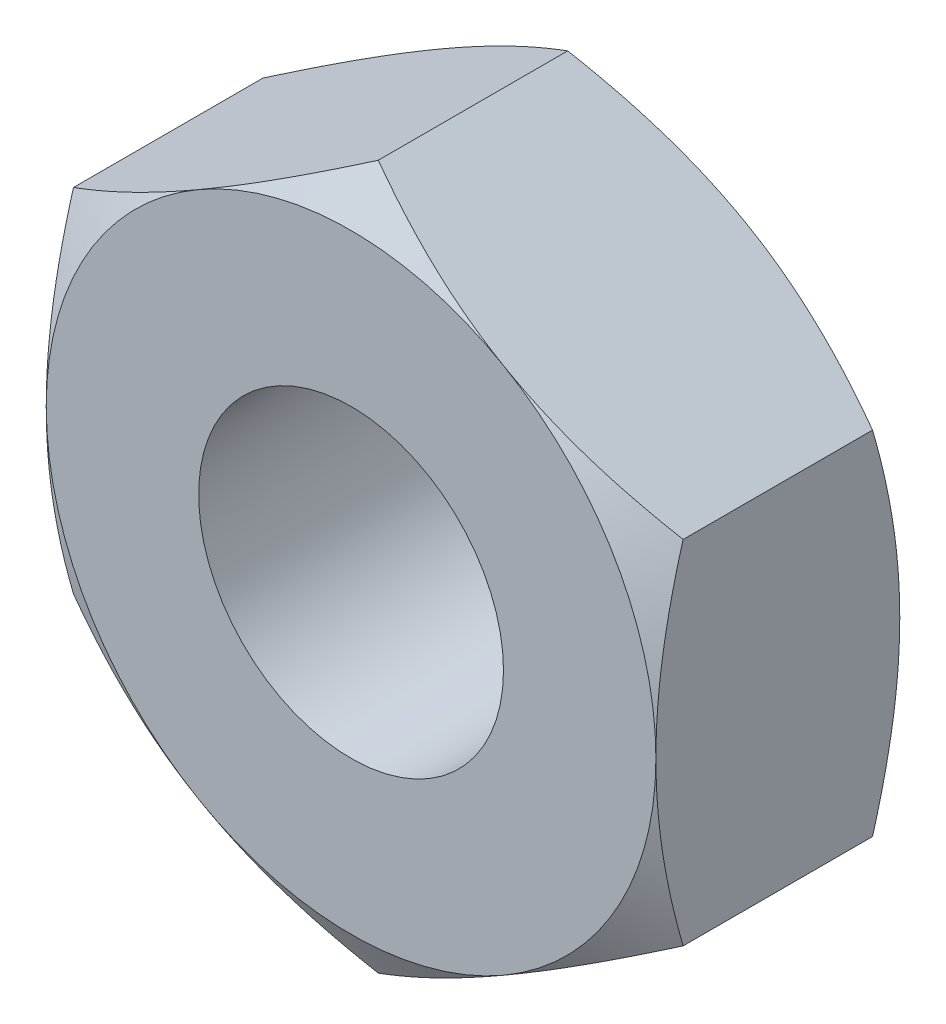
ISO-10303-21;
HEADER;
FILE_DESCRIPTION(('STEP AP214'),'2;1');
FILE_NAME('part.step','',(''),(''),'','','');
FILE_SCHEMA(('AUTOMOTIVE_DESIGN { 1 0 10303 214 1 1 1 1 }'));
ENDSEC;
DATA;
#1=APPLICATION_CONTEXT('core data for automotive mechanical design processes');
#2=APPLICATION_PROTOCOL_DEFINITION('international standard','automotive_design',2000,#1);
#3=PRODUCT_CONTEXT('',#1,'mechanical');
#4=PRODUCT('Part','Part','',(#3));
#5=PRODUCT_RELATED_PRODUCT_CATEGORY('part','',(#4));
#6=PRODUCT_DEFINITION_FORMATION('','',#4);
#7=PRODUCT_DEFINITION_CONTEXT('part definition',#1,'design');
#8=PRODUCT_DEFINITION('design','',#6,#7);
#9=PRODUCT_DEFINITION_SHAPE('','',#8);
#10=(LENGTH_UNIT() NAMED_UNIT(*) SI_UNIT(.MILLI.,.METRE.));
#11=(NAMED_UNIT(*) PLANE_ANGLE_UNIT() SI_UNIT($,.RADIAN.));
#12=(NAMED_UNIT(*) SI_UNIT($,.STERADIAN.) SOLID_ANGLE_UNIT());
#13=UNCERTAINTY_MEASURE_WITH_UNIT(LENGTH_MEASURE(1.E-05),#10,'distance_accuracy_value','');
#14=(GEOMETRIC_REPRESENTATION_CONTEXT(3) GLOBAL_UNCERTAINTY_ASSIGNED_CONTEXT((#13)) GLOBAL_UNIT_ASSIGNED_CONTEXT((#10,
#11,#12)) REPRESENTATION_CONTEXT('',''));
#15=CARTESIAN_POINT('',(0.,0.,0.));
#16=DIRECTION('',(0.,0.,1.));
#17=DIRECTION('',(1.,0.,0.));
#18=AXIS2_PLACEMENT_3D('',#15,#16,#17);
#19=CARTESIAN_POINT('',(0.,0.,-1.));
#20=DIRECTION('',(0.,0.,1.));
#21=DIRECTION('',(1.,0.,0.));
#22=AXIS2_PLACEMENT_3D('',#19,#20,#21);
#23=PLANE('',#22);
#24=CARTESIAN_POINT('',(0.,0.,-1.));
#25=DIRECTION('',(0.,0.,1.));
#26=DIRECTION('',(1.,0.,0.));
#27=AXIS2_PLACEMENT_3D('',#24,#25,#26);
#28=CIRCLE('',#27,1.25);
#29=CARTESIAN_POINT('',(1.25,0.,-1.));
#30=VERTEX_POINT('',#29);
#31=EDGE_CURVE('E256',#30,#30,#28,.T.);
#32=ORIENTED_EDGE('',*,*,#31,.T.);
#33=EDGE_LOOP('',(#32));
#34=FACE_BOUND('',#33,.T.);
#35=CARTESIAN_POINT('',(0.,0.,-1.));
#36=DIRECTION('',(0.,0.,1.));
#37=DIRECTION('',(1.,0.,0.));
#38=AXIS2_PLACEMENT_3D('',#35,#36,#37);
#39=CIRCLE('',#38,2.50000000000001);
#40=CARTESIAN_POINT('',(2.50000000000001,0.,-1.));
#41=VERTEX_POINT('',#40);
#42=CARTESIAN_POINT('',(1.25,2.1650635094611,-1.));
#43=VERTEX_POINT('',#42);
#44=EDGE_CURVE('E144',#41,#43,#39,.T.);
#45=ORIENTED_EDGE('',*,*,#44,.F.);
#46=CARTESIAN_POINT('',(0.,0.,-1.));
#47=DIRECTION('',(0.,0.,1.));
#48=DIRECTION('',(1.,0.,0.));
#49=AXIS2_PLACEMENT_3D('',#46,#47,#48);
#50=CIRCLE('',#49,2.50000000000001);
#51=CARTESIAN_POINT('',(1.25,-2.1650635094611,-1.));
#52=VERTEX_POINT('',#51);
#53=EDGE_CURVE('E12',#41,#52,#50,.F.);
#54=ORIENTED_EDGE('',*,*,#53,.T.);
#55=CARTESIAN_POINT('',(-1.25,-2.1650635094611,-1.));
#56=VERTEX_POINT('',#55);
#57=EDGE_CURVE('E52',#52,#56,#50,.F.);
#58=ORIENTED_EDGE('',*,*,#57,.T.);
#59=CARTESIAN_POINT('',(-2.50000000000001,0.,-1.));
#60=VERTEX_POINT('',#59);
#61=EDGE_CURVE('E507',#56,#60,#50,.F.);
#62=ORIENTED_EDGE('',*,*,#61,.T.);
#63=CARTESIAN_POINT('',(-1.25,2.1650635094611,-1.));
#64=VERTEX_POINT('',#63);
#65=EDGE_CURVE('E152',#60,#64,#50,.F.);
#66=ORIENTED_EDGE('',*,*,#65,.T.);
#67=EDGE_CURVE('E53',#64,#43,#50,.F.);
#68=ORIENTED_EDGE('',*,*,#67,.T.);
#69=EDGE_LOOP('',(#45,#54,#58,#62,#66,#68));
#70=FACE_BOUND('',#69,.T.);
#71=ADVANCED_FACE('F43',(#34,#70),#23,.F.);
#72=CARTESIAN_POINT('',(0.,0.,1.));
#73=DIRECTION('',(0.,0.,1.));
#74=DIRECTION('',(1.,0.,0.));
#75=AXIS2_PLACEMENT_3D('',#72,#73,#74);
#76=PLANE('',#75);
#77=CARTESIAN_POINT('',(0.,0.,1.));
#78=DIRECTION('',(0.,0.,1.));
#79=DIRECTION('',(1.,0.,0.));
#80=AXIS2_PLACEMENT_3D('',#77,#78,#79);
#81=CIRCLE('',#80,1.25);
#82=CARTESIAN_POINT('',(1.25,0.,1.));
#83=VERTEX_POINT('',#82);
#84=EDGE_CURVE('E259',#83,#83,#81,.T.);
#85=ORIENTED_EDGE('',*,*,#84,.F.);
#86=EDGE_LOOP('',(#85));
#87=FACE_BOUND('',#86,.T.);
#88=CARTESIAN_POINT('',(0.,0.,1.));
#89=DIRECTION('',(0.,0.,1.));
#90=DIRECTION('',(1.,0.,0.));
#91=AXIS2_PLACEMENT_3D('',#88,#89,#90);
#92=CIRCLE('',#91,2.50000000000001);
#93=CARTESIAN_POINT('',(1.25,-2.16506350946109,1.));
#94=VERTEX_POINT('',#93);
#95=CARTESIAN_POINT('',(2.49999999999999,0.,1.));
#96=VERTEX_POINT('',#95);
#97=EDGE_CURVE('E158',#94,#96,#92,.T.);
#98=ORIENTED_EDGE('',*,*,#97,.T.);
#99=CARTESIAN_POINT('',(1.25,2.1650635094611,1.));
#100=VERTEX_POINT('',#99);
#101=EDGE_CURVE('E162',#96,#100,#92,.T.);
#102=ORIENTED_EDGE('',*,*,#101,.T.);
#103=CARTESIAN_POINT('',(-1.25,2.1650635094611,1.));
#104=VERTEX_POINT('',#103);
#105=EDGE_CURVE('E307',#100,#104,#92,.T.);
#106=ORIENTED_EDGE('',*,*,#105,.T.);
#107=CARTESIAN_POINT('',(-2.5,0.,1.));
#108=VERTEX_POINT('',#107);
#109=EDGE_CURVE('E311',#104,#108,#92,.T.);
#110=ORIENTED_EDGE('',*,*,#109,.T.);
#111=CARTESIAN_POINT('',(-1.25,-2.16506350946109,1.));
#112=VERTEX_POINT('',#111);
#113=EDGE_CURVE('E313',#108,#112,#92,.T.);
#114=ORIENTED_EDGE('',*,*,#113,.T.);
#115=EDGE_CURVE('E160',#112,#94,#92,.T.);
#116=ORIENTED_EDGE('',*,*,#115,.T.);
#117=EDGE_LOOP('',(#98,#102,#106,#110,#114,#116));
#118=FACE_BOUND('',#117,.T.);
#119=ADVANCED_FACE('F288',(#87,#118),#76,.T.);
#120=CARTESIAN_POINT('',(2.49999999999999,1.44337567297407,1.));
#121=DIRECTION('',(-0.499999999999999,-0.866025403784439,0.));
#122=DIRECTION('',(0.866025403784439,-0.499999999999999,0.));
#123=AXIS2_PLACEMENT_3D('',#120,#121,#122);
#124=PLANE('',#123);
#125=DIRECTION('',(0.,0.,-1.));
#126=VECTOR('',#125,1.);
#127=CARTESIAN_POINT('',(2.49999999999999,1.44337567297407,1.));
#128=LINE('',#127,#126);
#129=CARTESIAN_POINT('',(2.49999999999999,1.44337567297407,0.776709006307406));
#130=VERTEX_POINT('',#129);
#131=CARTESIAN_POINT('',(2.49999999999999,1.44337567297407,-0.776709006307406));
#132=VERTEX_POINT('',#131);
#133=EDGE_CURVE('E157',#130,#132,#128,.T.);
#134=ORIENTED_EDGE('',*,*,#133,.T.);
#135=CARTESIAN_POINT('',(2.50019999999999,1.44326020292023,-0.776642335640899));
#136=CARTESIAN_POINT('',(2.39033676526512,1.50668977106846,-0.813278379892381));
#137=CARTESIAN_POINT('',(2.27952520010347,1.57066685804386,-0.84659778103495));
#138=CARTESIAN_POINT('',(2.05598316653394,1.69972891130042,-0.904757714442148));
#139=CARTESIAN_POINT('',(1.9432487254716,1.7648161711947,-0.929577670852267));
#140=CARTESIAN_POINT('',(1.71917700612472,1.89418403867741,-0.968214348558953));
#141=CARTESIAN_POINT('',(1.60787420823261,1.95844473900197,-0.982288203814366));
#142=CARTESIAN_POINT('',(1.38474477253166,2.08726857876805,-0.999090847647254));
#143=CARTESIAN_POINT('',(1.27291894598576,2.15183124982667,-1.00183354879638));
#144=CARTESIAN_POINT('',(1.06395802444847,2.27247489412634,-0.99613423999195));
#145=CARTESIAN_POINT('',(0.966791682442262,2.3285739078398,-0.989091605618142));
#146=CARTESIAN_POINT('',(0.773092050288991,2.44040644260542,-0.966768580875061));
#147=CARTESIAN_POINT('',(0.676559430340262,2.4961395767184,-0.951480561559736));
#148=CARTESIAN_POINT('',(0.482460278259519,2.60820277442169,-0.913260906155583));
#149=CARTESIAN_POINT('',(0.384918318217855,2.66451865130903,-0.890167223874487));
#150=CARTESIAN_POINT('',(0.191289391923911,2.77631036402774,-0.837753343422091));
#151=CARTESIAN_POINT('',(0.0951999441138209,2.83178763258718,-0.808445464375456));
#152=CARTESIAN_POINT('',(-0.000200000000002555,2.88686681600197,-0.776642335640896));
#153=B_SPLINE_CURVE_WITH_KNOTS('',3,(#135,#136,#137,#138,#139,#140,#141,#142,#143,#144,#145,
#146,#147,#148,#149,#150,#151,#152),.UNSPECIFIED.,.F.,.F.,(4,2,2,2,2,2,2,2,4),(0.,
0.396285827362226,0.793524330152049,1.18093086852114,1.56786160134475,1.90479741793733,
2.24204551660462,2.58677531536755,2.93082800105255),.UNSPECIFIED.);
#154=EDGE_CURVE('E65',#132,#43,#153,.T.);
#155=ORIENTED_EDGE('',*,*,#154,.T.);
#156=CARTESIAN_POINT('',(0.,2.88675134594813,-0.776709006307403));
#157=VERTEX_POINT('',#156);
#158=EDGE_CURVE('E133',#43,#157,#153,.T.);
#159=ORIENTED_EDGE('',*,*,#158,.T.);
#160=DIRECTION('',(0.,0.,-1.));
#161=VECTOR('',#160,1.);
#162=CARTESIAN_POINT('',(0.,2.88675134594813,1.));
#163=LINE('',#162,#161);
#164=CARTESIAN_POINT('',(0.,2.88675134594813,0.776709006307403));
#165=VERTEX_POINT('',#164);
#166=EDGE_CURVE('E275',#165,#157,#163,.T.);
#167=ORIENTED_EDGE('',*,*,#166,.F.);
#168=CARTESIAN_POINT('',(2.50019999999999,1.44326020292023,0.776642335640899));
#169=CARTESIAN_POINT('',(2.39033676526512,1.50668977106846,0.813278379892381));
#170=CARTESIAN_POINT('',(2.27952520010347,1.57066685804386,0.84659778103495));
#171=CARTESIAN_POINT('',(2.05598316653394,1.69972891130042,0.904757714442148));
#172=CARTESIAN_POINT('',(1.9432487254716,1.7648161711947,0.929577670852267));
#173=CARTESIAN_POINT('',(1.71917700612472,1.89418403867741,0.968214348558953));
#174=CARTESIAN_POINT('',(1.60787420823261,1.95844473900197,0.982288203814366));
#175=CARTESIAN_POINT('',(1.38474477253166,2.08726857876805,0.999090847647254));
#176=CARTESIAN_POINT('',(1.27291894598576,2.15183124982667,1.00183354879638));
#177=CARTESIAN_POINT('',(1.06395802444847,2.27247489412634,0.99613423999195));
#178=CARTESIAN_POINT('',(0.966791682442262,2.3285739078398,0.989091605618142));
#179=CARTESIAN_POINT('',(0.773092050288991,2.44040644260542,0.966768580875061));
#180=CARTESIAN_POINT('',(0.676559430340262,2.4961395767184,0.951480561559736));
#181=CARTESIAN_POINT('',(0.482460278259519,2.60820277442169,0.913260906155583));
#182=CARTESIAN_POINT('',(0.384918318217855,2.66451865130903,0.890167223874487));
#183=CARTESIAN_POINT('',(0.191289391923911,2.77631036402774,0.837753343422091));
#184=CARTESIAN_POINT('',(0.0951999441138209,2.83178763258718,0.808445464375456));
#185=CARTESIAN_POINT('',(-0.000200000000002555,2.88686681600197,0.776642335640896));
#186=B_SPLINE_CURVE_WITH_KNOTS('',3,(#168,#169,#170,#171,#172,#173,#174,#175,#176,#177,#178,
#179,#180,#181,#182,#183,#184,#185),.UNSPECIFIED.,.F.,.F.,(4,2,2,2,2,2,2,2,4),(0.,
0.396285827362226,0.793524330152049,1.18093086852114,1.56786160134475,1.90479741793733,
2.24204551660462,2.58677531536755,2.93082800105255),.UNSPECIFIED.);
#187=EDGE_CURVE('E249',#100,#165,#186,.T.);
#188=ORIENTED_EDGE('',*,*,#187,.F.);
#189=EDGE_CURVE('E255',#130,#100,#186,.T.);
#190=ORIENTED_EDGE('',*,*,#189,.F.);
#191=EDGE_LOOP('',(#134,#155,#159,#167,#188,#190));
#192=FACE_BOUND('',#191,.T.);
#193=ADVANCED_FACE('F45',(#192),#124,.F.);
#194=CARTESIAN_POINT('',(0.,2.88675134594813,1.));
#195=DIRECTION('',(0.5,-0.866025403784439,0.));
#196=DIRECTION('',(0.866025403784439,0.5,0.));
#197=AXIS2_PLACEMENT_3D('',#194,#195,#196);
#198=PLANE('',#197);
#199=ORIENTED_EDGE('',*,*,#166,.T.);
#200=CARTESIAN_POINT('',(0.000199999999997349,2.88686681600197,-0.776642335640896));
#201=CARTESIAN_POINT('',(-0.109663234734874,2.82343724785375,-0.813278379892378));
#202=CARTESIAN_POINT('',(-0.220474799896528,2.75946016087834,-0.846597781034948));
#203=CARTESIAN_POINT('',(-0.444016833466052,2.63039810762178,-0.904757714442146));
#204=CARTESIAN_POINT('',(-0.556751274528391,2.5653108477275,-0.929577670852265));
#205=CARTESIAN_POINT('',(-0.780822993875272,2.43594298024479,-0.968214348558951));
#206=CARTESIAN_POINT('',(-0.89212579176738,2.37168227992023,-0.982288203814364));
#207=CARTESIAN_POINT('',(-1.11525522746834,2.24285844015415,-0.999090847647253));
#208=CARTESIAN_POINT('',(-1.22708105401423,2.17829576909553,-1.00183354879638));
#209=CARTESIAN_POINT('',(-1.43604197555152,2.05765212479586,-0.996134239991949));
#210=CARTESIAN_POINT('',(-1.53320831755773,2.0015531110824,-0.989091605618141));
#211=CARTESIAN_POINT('',(-1.72690794971101,1.88972057631678,-0.96676858087506));
#212=CARTESIAN_POINT('',(-1.82344056965974,1.8339874422038,-0.951480561559735));
#213=CARTESIAN_POINT('',(-2.01753972174048,1.7219242445005,-0.913260906155582));
#214=CARTESIAN_POINT('',(-2.11508168178214,1.66560836761317,-0.890167223874485));
#215=CARTESIAN_POINT('',(-2.30871060807609,1.55381665489446,-0.83775334342209));
#216=CARTESIAN_POINT('',(-2.40480005588618,1.49833938633502,-0.808445464375454));
#217=CARTESIAN_POINT('',(-2.5002,1.44326020292023,-0.776642335640894));
#218=B_SPLINE_CURVE_WITH_KNOTS('',3,(#200,#201,#202,#203,#204,#205,#206,#207,#208,#209,#210,
#211,#212,#213,#214,#215,#216,#217),.UNSPECIFIED.,.F.,.F.,(4,2,2,2,2,2,2,2,4),(0.,
0.396285827362226,0.793524330152051,1.18093086852114,1.56786160134475,1.90479741793733,
2.24204551660463,2.58677531536756,2.93082800105256),.UNSPECIFIED.);
#219=EDGE_CURVE('E138',#157,#64,#218,.T.);
#220=ORIENTED_EDGE('',*,*,#219,.T.);
#221=CARTESIAN_POINT('',(-2.5,1.44337567297407,-0.776709006307401));
#222=VERTEX_POINT('',#221);
#223=EDGE_CURVE('E169',#64,#222,#218,.T.);
#224=ORIENTED_EDGE('',*,*,#223,.T.);
#225=DIRECTION('',(0.,0.,-1.));
#226=VECTOR('',#225,1.);
#227=CARTESIAN_POINT('',(-2.5,1.44337567297407,1.));
#228=LINE('',#227,#226);
#229=CARTESIAN_POINT('',(-2.5,1.44337567297407,0.776709006307401));
#230=VERTEX_POINT('',#229);
#231=EDGE_CURVE('E272',#230,#222,#228,.T.);
#232=ORIENTED_EDGE('',*,*,#231,.F.);
#233=CARTESIAN_POINT('',(0.000199999999997342,2.88686681600197,0.776642335640896));
#234=CARTESIAN_POINT('',(-0.109663234734874,2.82343724785375,0.813278379892378));
#235=CARTESIAN_POINT('',(-0.220474799896528,2.75946016087834,0.846597781034948));
#236=CARTESIAN_POINT('',(-0.444016833466053,2.63039810762178,0.904757714442146));
#237=CARTESIAN_POINT('',(-0.556751274528391,2.5653108477275,0.929577670852265));
#238=CARTESIAN_POINT('',(-0.780822993875272,2.43594298024479,0.968214348558951));
#239=CARTESIAN_POINT('',(-0.89212579176738,2.37168227992023,0.982288203814364));
#240=CARTESIAN_POINT('',(-1.11525522746834,2.24285844015415,0.999090847647253));
#241=CARTESIAN_POINT('',(-1.22708105401423,2.17829576909553,1.00183354879638));
#242=CARTESIAN_POINT('',(-1.43604197555152,2.05765212479586,0.996134239991949));
#243=CARTESIAN_POINT('',(-1.53320831755773,2.0015531110824,0.989091605618141));
#244=CARTESIAN_POINT('',(-1.72690794971101,1.88972057631678,0.96676858087506));
#245=CARTESIAN_POINT('',(-1.82344056965974,1.8339874422038,0.951480561559735));
#246=CARTESIAN_POINT('',(-2.01753972174048,1.7219242445005,0.913260906155582));
#247=CARTESIAN_POINT('',(-2.11508168178214,1.66560836761316,0.890167223874485));
#248=CARTESIAN_POINT('',(-2.30871060807609,1.55381665489446,0.837753343422089));
#249=CARTESIAN_POINT('',(-2.40480005588618,1.49833938633502,0.808445464375454));
#250=CARTESIAN_POINT('',(-2.5002,1.44326020292023,0.776642335640894));
#251=B_SPLINE_CURVE_WITH_KNOTS('',3,(#233,#234,#235,#236,#237,#238,#239,#240,#241,#242,#243,
#244,#245,#246,#247,#248,#249,#250),.UNSPECIFIED.,.F.,.F.,(4,2,2,2,2,2,2,2,4),(0.,
0.396285827362227,0.793524330152051,1.18093086852114,1.56786160134475,1.90479741793733,
2.24204551660463,2.58677531536756,2.93082800105256),.UNSPECIFIED.);
#252=EDGE_CURVE('E242',#104,#230,#251,.T.);
#253=ORIENTED_EDGE('',*,*,#252,.F.);
#254=EDGE_CURVE('E248',#165,#104,#251,.T.);
#255=ORIENTED_EDGE('',*,*,#254,.F.);
#256=EDGE_LOOP('',(#199,#220,#224,#232,#253,#255));
#257=FACE_BOUND('',#256,.T.);
#258=ADVANCED_FACE('F222',(#257),#198,.F.);
#259=CARTESIAN_POINT('',(-2.5,1.44337567297407,1.));
#260=DIRECTION('',(1.,0.,0.));
#261=DIRECTION('',(0.,1.,0.));
#262=AXIS2_PLACEMENT_3D('',#259,#260,#261);
#263=PLANE('',#262);
#264=ORIENTED_EDGE('',*,*,#231,.T.);
#265=CARTESIAN_POINT('',(-2.5,-3.93425573350289,0.247867421248394));
#266=CARTESIAN_POINT('',(-2.5,-3.82455805059036,0.194426831841063));
#267=CARTESIAN_POINT('',(-2.5,-3.71461457919922,0.141482424098895));
#268=CARTESIAN_POINT('',(-2.5,-3.49410553611727,0.0368639808984598));
#269=CARTESIAN_POINT('',(-2.5,-3.38353987453968,-0.014809864896019));
#270=CARTESIAN_POINT('',(-2.5,-3.16111337045581,-0.116856970846164));
#271=CARTESIAN_POINT('',(-2.5,-3.04924878505129,-0.167222100016645));
#272=CARTESIAN_POINT('',(-2.5,-2.82464950600592,-0.265965836196234));
#273=CARTESIAN_POINT('',(-2.5,-2.71191485216742,-0.314344533444712));
#274=CARTESIAN_POINT('',(-2.5,-2.48157262776063,-0.410183652907269));
#275=CARTESIAN_POINT('',(-2.5,-2.36392902979747,-0.457557943768869));
#276=CARTESIAN_POINT('',(-2.5,-2.12728680576954,-0.548857519780595));
#277=CARTESIAN_POINT('',(-2.5,-2.0082880325045,-0.592782426084271));
#278=CARTESIAN_POINT('',(-2.5,-1.7689508623124,-0.676072033695631));
#279=CARTESIAN_POINT('',(-2.5,-1.64861554080834,-0.715445486315183));
#280=CARTESIAN_POINT('',(-2.5,-1.4062196480392,-0.788406805742603));
#281=CARTESIAN_POINT('',(-2.5,-1.28415961458997,-0.821996434838304));
#282=CARTESIAN_POINT('',(-2.5,-1.03891951871328,-0.881638195313747));
#283=CARTESIAN_POINT('',(-2.5,-0.915749874717235,-0.907732394058759));
#284=CARTESIAN_POINT('',(-2.5,-0.667820858353001,-0.950944962578456));
#285=CARTESIAN_POINT('',(-2.5,-0.543061659704268,-0.9680643047244));
#286=CARTESIAN_POINT('',(-2.5,-0.294229287436146,-0.991740236915555));
#287=CARTESIAN_POINT('',(-2.5,-0.170169796975897,-0.998437081166277));
#288=CARTESIAN_POINT('',(-2.5,0.0780766721177555,-1.00107330127473));
#289=CARTESIAN_POINT('',(-2.5,0.20226365266606,-0.997012513118002));
#290=CARTESIAN_POINT('',(-2.5,0.411409603386496,-0.98140726696173));
#291=CARTESIAN_POINT('',(-2.5,0.49658467012454,-0.972575692039977));
#292=CARTESIAN_POINT('',(-2.5,0.666344729519183,-0.950371522415863));
#293=CARTESIAN_POINT('',(-2.5,0.750929646942494,-0.936998359161175));
#294=CARTESIAN_POINT('',(-2.5,1.00366547850548,-0.89076597166978));
#295=CARTESIAN_POINT('',(-2.5,1.17071375389144,-0.851800955950568));
#296=CARTESIAN_POINT('',(-2.5,1.4206286497043,-0.783796481710404));
#297=CARTESIAN_POINT('',(-2.5,1.50477790033849,-0.759198505927022));
#298=CARTESIAN_POINT('',(-2.5,1.67225987739084,-0.707339930418387));
#299=CARTESIAN_POINT('',(-2.5,1.75559259753029,-0.680079310236354));
#300=CARTESIAN_POINT('',(-2.5,1.9214668169918,-0.62334183850765));
#301=CARTESIAN_POINT('',(-2.5,2.00400853301611,-0.593865614720604));
#302=CARTESIAN_POINT('',(-2.5,2.16840002168345,-0.533054478519507));
#303=CARTESIAN_POINT('',(-2.5,2.25024980997479,-0.501719608268914));
#304=CARTESIAN_POINT('',(-2.5,2.47007598174685,-0.415156402748032));
#305=CARTESIAN_POINT('',(-2.5,2.60747896056648,-0.35847329125268));
#306=CARTESIAN_POINT('',(-2.5,2.88087320612347,-0.241787279064342));
#307=CARTESIAN_POINT('',(-2.5,3.01686431559251,-0.181784013152344));
#308=CARTESIAN_POINT('',(-2.5,3.28775370835403,-0.0592449840030355));
#309=CARTESIAN_POINT('',(-2.50000000000001,3.42265159686246,0.00329164910482754));
#310=CARTESIAN_POINT('',(-2.50000000000001,3.69153349422199,0.130303258328515));
#311=CARTESIAN_POINT('',(-2.50000000000001,3.82551747498239,0.19477829369839));
#312=CARTESIAN_POINT('',(-2.50000000000001,4.22678780126196,0.390652854962583));
#313=CARTESIAN_POINT('',(-2.50000000000001,4.49297167318086,0.524307966533664));
#314=CARTESIAN_POINT('',(-2.50000000000001,5.02332786921172,0.795387790277859));
#315=CARTESIAN_POINT('',(-2.50000000000001,5.2875006002244,0.932811712561525));
#316=CARTESIAN_POINT('',(-2.50000000000001,5.78669440868188,1.19560284648368));
#317=CARTESIAN_POINT('',(-2.50000000000001,6.02185115681081,1.32071278415739));
#318=CARTESIAN_POINT('',(-2.50000000000001,6.49137306451876,1.57244119096535));
#319=CARTESIAN_POINT('',(-2.50000000000001,6.72573817462959,1.69905975221195));
#320=CARTESIAN_POINT('',(-2.50000000000001,7.19307671922481,1.95299069369912));
#321=CARTESIAN_POINT('',(-2.50000000000001,7.42605218661544,2.08029933697469));
#322=CARTESIAN_POINT('',(-2.50000000000001,7.8915086293687,2.33577450313904));
#323=CARTESIAN_POINT('',(-2.50000000000001,8.1239896421873,2.46394095775789));
#324=CARTESIAN_POINT('',(-2.50000000000001,8.35629687655467,2.59241944759749));
#325=B_SPLINE_CURVE_WITH_KNOTS('',3,(#265,#266,#267,#268,#269,#270,#271,#272,#273,#274,#275,
#276,#277,#278,#279,#280,#281,#282,#283,#284,#285,#286,#287,#288,#289,#290,#291,#292,#293,#294,
#295,#296,#297,#298,#299,#300,#301,#302,#303,#304,#305,#306,#307,#308,#309,#310,#311,#312,#313,
#314,#315,#316,#317,#318,#319,#320,#321,#322,#323,#324),.UNSPECIFIED.,.F.,.F.,(4,2,2,2,2,2,2,2,
2,2,2,2,2,2,2,2,2,2,2,2,2,2,2,2,2,2,2,2,2,4),(0.,0.366071555698272,0.732197429176889,
1.10022131388628,1.46822846151579,1.84865877125671,2.22913080545098,2.60885867061217,
2.98847063000568,3.36590845584489,3.74330538013014,4.11557840831441,4.48785711233042,
4.74462879039507,5.00143262504743,5.51529119875922,5.77827949353832,6.04126980898419,
6.30418588874309,6.56709600652125,7.0129377385577,7.45882861133188,7.90487390731068,
8.3509328521168,9.24444045956448,10.1377622104064,10.9368546386539,11.7359961098642,
12.5324647628885,13.3288707644253),.UNSPECIFIED.);
#326=EDGE_CURVE('E216',#222,#60,#325,.F.);
#327=ORIENTED_EDGE('',*,*,#326,.T.);
#328=CARTESIAN_POINT('',(-2.5,-1.44337567297405,-0.776709006307406));
#329=VERTEX_POINT('',#328);
#330=EDGE_CURVE('E209',#60,#329,#325,.F.);
#331=ORIENTED_EDGE('',*,*,#330,.T.);
#332=DIRECTION('',(0.,0.,-1.));
#333=VECTOR('',#332,1.);
#334=CARTESIAN_POINT('',(-2.5,-1.44337567297405,1.));
#335=LINE('',#334,#333);
#336=CARTESIAN_POINT('',(-2.5,-1.44337567297405,0.776709006307406));
#337=VERTEX_POINT('',#336);
#338=EDGE_CURVE('E269',#337,#329,#335,.T.);
#339=ORIENTED_EDGE('',*,*,#338,.F.);
#340=CARTESIAN_POINT('',(-2.5,-3.93425573350289,-0.247867421248394));
#341=CARTESIAN_POINT('',(-2.5,-3.82455805059036,-0.194426831841063));
#342=CARTESIAN_POINT('',(-2.5,-3.71461457919922,-0.141482424098895));
#343=CARTESIAN_POINT('',(-2.5,-3.49410553611727,-0.0368639808984596));
#344=CARTESIAN_POINT('',(-2.5,-3.38353987453968,0.0148098648960192));
#345=CARTESIAN_POINT('',(-2.5,-3.16111337045581,0.116856970846164));
#346=CARTESIAN_POINT('',(-2.5,-3.04924878505129,0.167222100016645));
#347=CARTESIAN_POINT('',(-2.5,-2.82464950600592,0.265965836196234));
#348=CARTESIAN_POINT('',(-2.5,-2.71191485216742,0.314344533444713));
#349=CARTESIAN_POINT('',(-2.5,-2.48157262776063,0.41018365290727));
#350=CARTESIAN_POINT('',(-2.5,-2.36392902979747,0.457557943768869));
#351=CARTESIAN_POINT('',(-2.5,-2.12728680576953,0.548857519780596));
#352=CARTESIAN_POINT('',(-2.5,-2.0082880325045,0.592782426084272));
#353=CARTESIAN_POINT('',(-2.5,-1.7689508623124,0.676072033695631));
#354=CARTESIAN_POINT('',(-2.5,-1.64861554080834,0.715445486315183));
#355=CARTESIAN_POINT('',(-2.5,-1.4062196480392,0.788406805742603));
#356=CARTESIAN_POINT('',(-2.5,-1.28415961458997,0.821996434838304));
#357=CARTESIAN_POINT('',(-2.5,-1.03891951871328,0.881638195313747));
#358=CARTESIAN_POINT('',(-2.5,-0.915749874717236,0.90773239405876));
#359=CARTESIAN_POINT('',(-2.5,-0.667820858353002,0.950944962578456));
#360=CARTESIAN_POINT('',(-2.5,-0.543061659704268,0.9680643047244));
#361=CARTESIAN_POINT('',(-2.5,-0.294229287436146,0.991740236915555));
#362=CARTESIAN_POINT('',(-2.5,-0.170169796975897,0.998437081166277));
#363=CARTESIAN_POINT('',(-2.5,0.0780766721177555,1.00107330127473));
#364=CARTESIAN_POINT('',(-2.5,0.20226365266606,0.997012513118002));
#365=CARTESIAN_POINT('',(-2.5,0.411409603386496,0.98140726696173));
#366=CARTESIAN_POINT('',(-2.5,0.49658467012454,0.972575692039977));
#367=CARTESIAN_POINT('',(-2.5,0.666344729519183,0.950371522415863));
#368=CARTESIAN_POINT('',(-2.5,0.750929646942494,0.936998359161175));
#369=CARTESIAN_POINT('',(-2.5,1.00366547850548,0.89076597166978));
#370=CARTESIAN_POINT('',(-2.5,1.17071375389144,0.851800955950568));
#371=CARTESIAN_POINT('',(-2.5,1.4206286497043,0.783796481710404));
#372=CARTESIAN_POINT('',(-2.5,1.50477790033849,0.759198505927022));
#373=CARTESIAN_POINT('',(-2.5,1.67225987739084,0.707339930418387));
#374=CARTESIAN_POINT('',(-2.5,1.75559259753029,0.680079310236354));
#375=CARTESIAN_POINT('',(-2.5,1.9214668169918,0.62334183850765));
#376=CARTESIAN_POINT('',(-2.5,2.00400853301611,0.593865614720603));
#377=CARTESIAN_POINT('',(-2.5,2.16840002168345,0.533054478519506));
#378=CARTESIAN_POINT('',(-2.5,2.25024980997479,0.501719608268913));
#379=CARTESIAN_POINT('',(-2.5,2.47007598174685,0.415156402748032));
#380=CARTESIAN_POINT('',(-2.5,2.60747896056648,0.35847329125268));
#381=CARTESIAN_POINT('',(-2.5,2.88087320612347,0.241787279064343));
#382=CARTESIAN_POINT('',(-2.5,3.01686431559251,0.181784013152345));
#383=CARTESIAN_POINT('',(-2.5,3.28775370835403,0.0592449840030359));
#384=CARTESIAN_POINT('',(-2.50000000000001,3.42265159686246,-0.00329164910482739));
#385=CARTESIAN_POINT('',(-2.50000000000001,3.69153349422199,-0.130303258328515));
#386=CARTESIAN_POINT('',(-2.50000000000001,3.82551747498239,-0.194778293698389));
#387=CARTESIAN_POINT('',(-2.50000000000001,4.22678780126195,-0.39065285496258));
#388=CARTESIAN_POINT('',(-2.50000000000001,4.49297167318085,-0.524307966533661));
#389=CARTESIAN_POINT('',(-2.50000000000001,5.02332786921172,-0.795387790277856));
#390=CARTESIAN_POINT('',(-2.50000000000001,5.28750060022439,-0.932811712561521));
#391=CARTESIAN_POINT('',(-2.50000000000001,5.78669440868187,-1.19560284648368));
#392=CARTESIAN_POINT('',(-2.50000000000001,6.02185115681081,-1.32071278415739));
#393=CARTESIAN_POINT('',(-2.50000000000001,6.49137306451876,-1.57244119096535));
#394=CARTESIAN_POINT('',(-2.50000000000001,6.72573817462958,-1.69905975221195));
#395=CARTESIAN_POINT('',(-2.50000000000001,7.19307671922481,-1.95299069369911));
#396=CARTESIAN_POINT('',(-2.50000000000001,7.42605218661544,-2.08029933697469));
#397=CARTESIAN_POINT('',(-2.50000000000001,7.8915086293687,-2.33577450313903));
#398=CARTESIAN_POINT('',(-2.50000000000001,8.12398964218729,-2.46394095775789));
#399=CARTESIAN_POINT('',(-2.50000000000001,8.35629687655467,-2.59241944759748));
#400=B_SPLINE_CURVE_WITH_KNOTS('',3,(#340,#341,#342,#343,#344,#345,#346,#347,#348,#349,#350,
#351,#352,#353,#354,#355,#356,#357,#358,#359,#360,#361,#362,#363,#364,#365,#366,#367,#368,#369,
#370,#371,#372,#373,#374,#375,#376,#377,#378,#379,#380,#381,#382,#383,#384,#385,#386,#387,#388,
#389,#390,#391,#392,#393,#394,#395,#396,#397,#398,#399),.UNSPECIFIED.,.F.,.F.,(4,2,2,2,2,2,2,2,
2,2,2,2,2,2,2,2,2,2,2,2,2,2,2,2,2,2,2,2,2,4),(0.,0.366071555698272,0.732197429176889,
1.10022131388628,1.46822846151579,1.84865877125671,2.22913080545098,2.60885867061217,
2.98847063000568,3.36590845584489,3.74330538013014,4.11557840831441,4.48785711233042,
4.74462879039507,5.00143262504743,5.51529119875922,5.77827949353832,6.04126980898419,
6.30418588874309,6.56709600652125,7.0129377385577,7.45882861133188,7.90487390731068,
8.3509328521168,9.24444045956447,10.1377622104064,10.9368546386539,11.7359961098642,
12.5324647628885,13.3288707644253),.UNSPECIFIED.);
#401=EDGE_CURVE('E228',#108,#337,#400,.F.);
#402=ORIENTED_EDGE('',*,*,#401,.F.);
#403=EDGE_CURVE('E235',#230,#108,#400,.F.);
#404=ORIENTED_EDGE('',*,*,#403,.F.);
#405=EDGE_LOOP('',(#264,#327,#331,#339,#402,#404));
#406=FACE_BOUND('',#405,.T.);
#407=ADVANCED_FACE('F218',(#406),#263,.F.);
#408=CARTESIAN_POINT('',(-2.5,-1.44337567297405,1.));
#409=DIRECTION('',(0.5,0.866025403784439,0.));
#410=DIRECTION('',(-0.866025403784439,0.5,0.));
#411=AXIS2_PLACEMENT_3D('',#408,#409,#410);
#412=PLANE('',#411);
#413=ORIENTED_EDGE('',*,*,#338,.T.);
#414=CARTESIAN_POINT('',(-2.5002,-1.44326020292021,-0.776642335640899));
#415=CARTESIAN_POINT('',(-2.39033676526513,-1.50668977106843,-0.813278379892381));
#416=CARTESIAN_POINT('',(-2.27952520010348,-1.57066685804384,-0.846597781034951));
#417=CARTESIAN_POINT('',(-2.05598316653395,-1.6997289113004,-0.90475771444215));
#418=CARTESIAN_POINT('',(-1.94324872547162,-1.76481617119468,-0.92957767085227));
#419=CARTESIAN_POINT('',(-1.71917700612474,-1.89418403867739,-0.968214348558957));
#420=CARTESIAN_POINT('',(-1.60787420823263,-1.95844473900195,-0.98228820381437));
#421=CARTESIAN_POINT('',(-1.38474477253167,-2.08726857876803,-0.999090847647259));
#422=CARTESIAN_POINT('',(-1.27291894598578,-2.15183124982665,-1.00183354879638));
#423=CARTESIAN_POINT('',(-1.06395802444848,-2.27247489412632,-0.996134239991957));
#424=CARTESIAN_POINT('',(-0.966791682442273,-2.32857390783978,-0.989091605618149));
#425=CARTESIAN_POINT('',(-0.773092050289001,-2.4404064426054,-0.966768580875068));
#426=CARTESIAN_POINT('',(-0.67655943034027,-2.49613957671838,-0.951480561559744));
#427=CARTESIAN_POINT('',(-0.482460278259525,-2.60820277442168,-0.913260906155591));
#428=CARTESIAN_POINT('',(-0.384918318217861,-2.66451865130902,-0.890167223874494));
#429=CARTESIAN_POINT('',(-0.191289391923915,-2.77631036402773,-0.837753343422098));
#430=CARTESIAN_POINT('',(-0.0951999441138235,-2.83178763258716,-0.808445464375462));
#431=CARTESIAN_POINT('',(0.000200000000000936,-2.88686681600196,-0.776642335640902));
#432=B_SPLINE_CURVE_WITH_KNOTS('',3,(#414,#415,#416,#417,#418,#419,#420,#421,#422,#423,#424,
#425,#426,#427,#428,#429,#430,#431),.UNSPECIFIED.,.F.,.F.,(4,2,2,2,2,2,2,2,4),(0.,
0.396285827362226,0.79352433015205,1.18093086852114,1.56786160134475,1.90479741793733,
2.24204551660463,2.58677531536756,2.93082800105257),.UNSPECIFIED.);
#433=EDGE_CURVE('E217',#329,#56,#432,.T.);
#434=ORIENTED_EDGE('',*,*,#433,.T.);
#435=CARTESIAN_POINT('',(0.,-2.88675134594812,-0.776709006307409));
#436=VERTEX_POINT('',#435);
#437=EDGE_CURVE('E203',#56,#436,#432,.T.);
#438=ORIENTED_EDGE('',*,*,#437,.T.);
#439=DIRECTION('',(0.,0.,-1.));
#440=VECTOR('',#439,1.);
#441=CARTESIAN_POINT('',(0.,-2.88675134594812,1.));
#442=LINE('',#441,#440);
#443=CARTESIAN_POINT('',(0.,-2.88675134594812,0.776709006307409));
#444=VERTEX_POINT('',#443);
#445=EDGE_CURVE('E266',#444,#436,#442,.T.);
#446=ORIENTED_EDGE('',*,*,#445,.F.);
#447=CARTESIAN_POINT('',(-2.5002,-1.44326020292021,0.776642335640899));
#448=CARTESIAN_POINT('',(-2.39033676526513,-1.50668977106843,0.813278379892381));
#449=CARTESIAN_POINT('',(-2.27952520010348,-1.57066685804384,0.846597781034951));
#450=CARTESIAN_POINT('',(-2.05598316653395,-1.6997289113004,0.90475771444215));
#451=CARTESIAN_POINT('',(-1.94324872547162,-1.76481617119468,0.92957767085227));
#452=CARTESIAN_POINT('',(-1.71917700612474,-1.89418403867739,0.968214348558957));
#453=CARTESIAN_POINT('',(-1.60787420823263,-1.95844473900195,0.98228820381437));
#454=CARTESIAN_POINT('',(-1.38474477253167,-2.08726857876803,0.999090847647259));
#455=CARTESIAN_POINT('',(-1.27291894598578,-2.15183124982665,1.00183354879638));
#456=CARTESIAN_POINT('',(-1.06395802444848,-2.27247489412632,0.996134239991957));
#457=CARTESIAN_POINT('',(-0.966791682442273,-2.32857390783978,0.989091605618149));
#458=CARTESIAN_POINT('',(-0.773092050289001,-2.4404064426054,0.966768580875068));
#459=CARTESIAN_POINT('',(-0.67655943034027,-2.49613957671838,0.951480561559744));
#460=CARTESIAN_POINT('',(-0.482460278259525,-2.60820277442168,0.913260906155591));
#461=CARTESIAN_POINT('',(-0.384918318217861,-2.66451865130902,0.890167223874494));
#462=CARTESIAN_POINT('',(-0.191289391923915,-2.77631036402773,0.837753343422098));
#463=CARTESIAN_POINT('',(-0.0951999441138235,-2.83178763258716,0.808445464375462));
#464=CARTESIAN_POINT('',(0.000200000000000936,-2.88686681600196,0.776642335640902));
#465=B_SPLINE_CURVE_WITH_KNOTS('',3,(#447,#448,#449,#450,#451,#452,#453,#454,#455,#456,#457,
#458,#459,#460,#461,#462,#463,#464),.UNSPECIFIED.,.F.,.F.,(4,2,2,2,2,2,2,2,4),(0.,
0.396285827362226,0.79352433015205,1.18093086852114,1.56786160134475,1.90479741793733,
2.24204551660463,2.58677531536756,2.93082800105257),.UNSPECIFIED.);
#466=EDGE_CURVE('E237',#112,#444,#465,.T.);
#467=ORIENTED_EDGE('',*,*,#466,.F.);
#468=EDGE_CURVE('E236',#337,#112,#465,.T.);
#469=ORIENTED_EDGE('',*,*,#468,.F.);
#470=EDGE_LOOP('',(#413,#434,#438,#446,#467,#469));
#471=FACE_BOUND('',#470,.T.);
#472=ADVANCED_FACE('F221',(#471),#412,.F.);
#473=CARTESIAN_POINT('',(0.,-2.88675134594812,1.));
#474=DIRECTION('',(-0.5,0.866025403784438,0.));
#475=DIRECTION('',(-0.866025403784438,-0.5,0.));
#476=AXIS2_PLACEMENT_3D('',#473,#474,#475);
#477=PLANE('',#476);
#478=ORIENTED_EDGE('',*,*,#445,.T.);
#479=CARTESIAN_POINT('',(-0.000199999999998766,-2.88686681600196,-0.776642335640902));
#480=CARTESIAN_POINT('',(0.109663234734872,-2.82343724785374,-0.813278379892384));
#481=CARTESIAN_POINT('',(0.220474799896526,-2.75946016087833,-0.846597781034954));
#482=CARTESIAN_POINT('',(0.444016833466049,-2.63039810762177,-0.904757714442152));
#483=CARTESIAN_POINT('',(0.556751274528387,-2.56531084772749,-0.929577670852271));
#484=CARTESIAN_POINT('',(0.780822993875267,-2.43594298024478,-0.968214348558957));
#485=CARTESIAN_POINT('',(0.892125791767375,-2.37168227992022,-0.98228820381437));
#486=CARTESIAN_POINT('',(1.11525522746833,-2.24285844015414,-0.999090847647259));
#487=CARTESIAN_POINT('',(1.22708105401422,-2.17829576909552,-1.00183354879638));
#488=CARTESIAN_POINT('',(1.43604197555152,-2.05765212479585,-0.996134239991956));
#489=CARTESIAN_POINT('',(1.53320831755773,-2.00155311108239,-0.989091605618148));
#490=CARTESIAN_POINT('',(1.726907949711,-1.88972057631677,-0.966768580875067));
#491=CARTESIAN_POINT('',(1.82344056965973,-1.83398744220379,-0.951480561559742));
#492=CARTESIAN_POINT('',(2.01753972174047,-1.7219242445005,-0.913260906155589));
#493=CARTESIAN_POINT('',(2.11508168178213,-1.66560836761316,-0.890167223874493));
#494=CARTESIAN_POINT('',(2.30871060807608,-1.55381665489445,-0.837753343422097));
#495=CARTESIAN_POINT('',(2.40480005588617,-1.49833938633501,-0.808445464375462));
#496=CARTESIAN_POINT('',(2.50019999999999,-1.44326020292022,-0.776642335640902));
#497=B_SPLINE_CURVE_WITH_KNOTS('',3,(#479,#480,#481,#482,#483,#484,#485,#486,#487,#488,#489,
#490,#491,#492,#493,#494,#495,#496),.UNSPECIFIED.,.F.,.F.,(4,2,2,2,2,2,2,2,4),(0.,
0.396285827362225,0.793524330152048,1.18093086852114,1.56786160134475,1.90479741793732,
2.24204551660462,2.58677531536755,2.93082800105255),.UNSPECIFIED.);
#498=EDGE_CURVE('E333',#436,#52,#497,.T.);
#499=ORIENTED_EDGE('',*,*,#498,.T.);
#500=CARTESIAN_POINT('',(2.49999999999999,-1.44337567297418,-0.77670900630749));
#501=VERTEX_POINT('',#500);
#502=EDGE_CURVE('E196',#52,#501,#497,.T.);
#503=ORIENTED_EDGE('',*,*,#502,.T.);
#504=DIRECTION('',(0.,0.,-1.));
#505=VECTOR('',#504,1.);
#506=CARTESIAN_POINT('',(2.49999999999999,-1.44337567297406,1.));
#507=LINE('',#506,#505);
#508=CARTESIAN_POINT('',(2.49999999999999,-1.44337567297418,0.77670900630749));
#509=VERTEX_POINT('',#508);
#510=EDGE_CURVE('E263',#509,#501,#507,.T.);
#511=ORIENTED_EDGE('',*,*,#510,.F.);
#512=CARTESIAN_POINT('',(-0.000199999999998766,-2.88686681600196,0.776642335640902));
#513=CARTESIAN_POINT('',(0.109663234734872,-2.82343724785374,0.813278379892384));
#514=CARTESIAN_POINT('',(0.220474799896526,-2.75946016087833,0.846597781034954));
#515=CARTESIAN_POINT('',(0.444016833466049,-2.63039810762177,0.904757714442152));
#516=CARTESIAN_POINT('',(0.556751274528387,-2.56531084772749,0.929577670852271));
#517=CARTESIAN_POINT('',(0.780822993875267,-2.43594298024478,0.968214348558957));
#518=CARTESIAN_POINT('',(0.892125791767375,-2.37168227992022,0.98228820381437));
#519=CARTESIAN_POINT('',(1.11525522746833,-2.24285844015414,0.999090847647259));
#520=CARTESIAN_POINT('',(1.22708105401422,-2.17829576909552,1.00183354879638));
#521=CARTESIAN_POINT('',(1.43604197555152,-2.05765212479585,0.996134239991956));
#522=CARTESIAN_POINT('',(1.53320831755773,-2.00155311108239,0.989091605618148));
#523=CARTESIAN_POINT('',(1.726907949711,-1.88972057631677,0.966768580875067));
#524=CARTESIAN_POINT('',(1.82344056965973,-1.83398744220379,0.951480561559742));
#525=CARTESIAN_POINT('',(2.01753972174047,-1.7219242445005,0.913260906155589));
#526=CARTESIAN_POINT('',(2.11508168178213,-1.66560836761316,0.890167223874493));
#527=CARTESIAN_POINT('',(2.30871060807608,-1.55381665489445,0.837753343422097));
#528=CARTESIAN_POINT('',(2.40480005588617,-1.49833938633501,0.808445464375462));
#529=CARTESIAN_POINT('',(2.50019999999999,-1.44326020292022,0.776642335640902));
#530=B_SPLINE_CURVE_WITH_KNOTS('',3,(#512,#513,#514,#515,#516,#517,#518,#519,#520,#521,#522,
#523,#524,#525,#526,#527,#528,#529),.UNSPECIFIED.,.F.,.F.,(4,2,2,2,2,2,2,2,4),(0.,
0.396285827362225,0.793524330152048,1.18093086852114,1.56786160134475,1.90479741793732,
2.24204551660462,2.58677531536755,2.93082800105255),.UNSPECIFIED.);
#531=EDGE_CURVE('E295',#94,#509,#530,.T.);
#532=ORIENTED_EDGE('',*,*,#531,.F.);
#533=EDGE_CURVE('E300',#444,#94,#530,.T.);
#534=ORIENTED_EDGE('',*,*,#533,.F.);
#535=EDGE_LOOP('',(#478,#499,#503,#511,#532,#534));
#536=FACE_BOUND('',#535,.T.);
#537=ADVANCED_FACE('F286',(#536),#477,.F.);
#538=CARTESIAN_POINT('',(2.49999999999999,-1.44337567297406,1.));
#539=DIRECTION('',(-1.,0.,0.));
#540=DIRECTION('',(0.,-1.,0.));
#541=AXIS2_PLACEMENT_3D('',#538,#539,#540);
#542=PLANE('',#541);
#543=ORIENTED_EDGE('',*,*,#510,.T.);
#544=CARTESIAN_POINT('',(2.49999999999999,-3.93425573570189,0.247867422319945));
#545=CARTESIAN_POINT('',(2.49999999999999,-3.82455805271533,0.194426832867959));
#546=CARTESIAN_POINT('',(2.49999999999999,-3.7146145812501,0.141482425081161));
#547=CARTESIAN_POINT('',(2.49999999999999,-3.49410553801975,0.036863981791681));
#548=CARTESIAN_POINT('',(2.49999999999999,-3.38353987636785,-0.0148098640472126));
#549=CARTESIAN_POINT('',(2.49999999999999,-3.16111337213424,-0.116856970086209));
#550=CARTESIAN_POINT('',(2.49999999999999,-3.04924878665429,-0.167222099301118));
#551=CARTESIAN_POINT('',(2.49999999999999,-2.82464950745754,-0.265965835568834));
#552=CARTESIAN_POINT('',(2.49999999999999,-2.7119148535431,-0.31434453286101));
#553=CARTESIAN_POINT('',(2.49999999999999,-2.48157262897843,-0.410183652412293));
#554=CARTESIAN_POINT('',(2.49999999999999,-2.36392903093327,-0.457557943318818));
#555=CARTESIAN_POINT('',(2.49999999999999,-2.12728680674004,-0.548857519418018));
#556=CARTESIAN_POINT('',(2.49999999999999,-2.0082880333917,-0.592782425764242));
#557=CARTESIAN_POINT('',(2.49999999999999,-1.76895086303146,-0.676072033456666));
#558=CARTESIAN_POINT('',(2.49999999999999,-1.64861554144256,-0.715445486114748));
#559=CARTESIAN_POINT('',(2.49999999999999,-1.40621964850145,-0.788406805613));
#560=CARTESIAN_POINT('',(2.49999999999999,-1.28415961496509,-0.82199643474101));
#561=CARTESIAN_POINT('',(2.49999999999999,-1.03891951886981,-0.881638195281715));
#562=CARTESIAN_POINT('',(2.49999999999999,-0.915749874741698,-0.907732394057231));
#563=CARTESIAN_POINT('',(2.49999999999999,-0.667820858110103,-0.950944962618075));
#564=CARTESIAN_POINT('',(2.49999999999999,-0.543061659326077,-0.968064304774679));
#565=CARTESIAN_POINT('',(2.49999999999999,-0.294229286789582,-0.991740236963005));
#566=CARTESIAN_POINT('',(2.49999999999999,-0.170169796196281,-0.99843708120069));
#567=CARTESIAN_POINT('',(2.49999999999999,0.0780766731614988,-1.00107330125972));
#568=CARTESIAN_POINT('',(2.49999999999999,0.202263653840878,-0.997012513066594));
#569=CARTESIAN_POINT('',(2.49999999999999,0.411409604725255,-0.981407266836742));
#570=CARTESIAN_POINT('',(2.49999999999999,0.496584671497652,-0.972575691885879));
#571=CARTESIAN_POINT('',(2.49999999999999,0.666344730959447,-0.950371522202008));
#572=CARTESIAN_POINT('',(2.49999999999999,0.750929648415556,-0.936998358916673));
#573=CARTESIAN_POINT('',(2.49999999999999,1.00366548007512,-0.890765971332706));
#574=CARTESIAN_POINT('',(2.49999999999999,1.17071375552288,-0.851800955550979));
#575=CARTESIAN_POINT('',(2.49999999999999,1.42062865142818,-0.783796481218608));
#576=CARTESIAN_POINT('',(2.49999999999999,1.50477790209385,-0.75919850540428));
#577=CARTESIAN_POINT('',(2.49999999999999,1.67225987920882,-0.707339929834717));
#578=CARTESIAN_POINT('',(2.49999999999999,1.75559259937938,-0.680079309622703));
#579=CARTESIAN_POINT('',(2.49999999999999,1.92146681890291,-0.623341837835128));
#580=CARTESIAN_POINT('',(2.49999999999999,2.00400853495811,-0.593865614019195));
#581=CARTESIAN_POINT('',(2.49999999999999,2.16840002368722,-0.533054477761347));
#582=CARTESIAN_POINT('',(2.49999999999999,2.25024981200945,-0.501719607482889));
#583=CARTESIAN_POINT('',(2.49999999999999,2.47007598379899,-0.415156401914111));
#584=CARTESIAN_POINT('',(2.49999999999999,2.60747896260611,-0.358473290401734));
#585=CARTESIAN_POINT('',(2.49999999999999,2.88087320813971,-0.241787278184275));
#586=CARTESIAN_POINT('',(2.49999999999999,3.01686431759786,-0.181784012260181));
#587=CARTESIAN_POINT('',(2.49999999999999,3.28775371033878,-0.0592449830902464));
#588=CARTESIAN_POINT('',(2.49999999999999,3.4226515988375,0.00329165002614323));
#589=CARTESIAN_POINT('',(2.49999999999999,3.69153349617863,0.130303259264342));
#590=CARTESIAN_POINT('',(2.49999999999999,3.82551747693034,0.194778294640202));
#591=CARTESIAN_POINT('',(2.49999999999999,4.22678780318398,0.390652855919117));
#592=CARTESIAN_POINT('',(2.49999999999999,4.49297167508683,0.524307967496161));
#593=CARTESIAN_POINT('',(2.49999999999999,5.02332787108773,0.795387791248312));
#594=CARTESIAN_POINT('',(2.49999999999999,5.28750060208647,0.932811713533974));
#595=CARTESIAN_POINT('',(2.49999999999999,5.78669441053014,1.19560284746361));
#596=CARTESIAN_POINT('',(2.49999999999999,6.02185115865902,1.32071278514316));
#597=CARTESIAN_POINT('',(2.49999999999999,6.49137306636742,1.5724411919616));
#598=CARTESIAN_POINT('',(2.49999999999999,6.72573817647875,1.69905975321284));
#599=CARTESIAN_POINT('',(2.49999999999999,7.19307672107734,1.95299069470955));
#600=CARTESIAN_POINT('',(2.49999999999999,7.42605218847082,2.08029933799004));
#601=CARTESIAN_POINT('',(2.49999999999999,7.89150863123015,2.33577450416367));
#602=CARTESIAN_POINT('',(2.49999999999999,8.12398964405194,2.4639409587869));
#603=CARTESIAN_POINT('',(2.49999999999999,8.35629687842262,2.59241944863069));
#604=B_SPLINE_CURVE_WITH_KNOTS('',3,(#544,#545,#546,#547,#548,#549,#550,#551,#552,#553,#554,
#555,#556,#557,#558,#559,#560,#561,#562,#563,#564,#565,#566,#567,#568,#569,#570,#571,#572,#573,
#574,#575,#576,#577,#578,#579,#580,#581,#582,#583,#584,#585,#586,#587,#588,#589,#590,#591,#592,
#593,#594,#595,#596,#597,#598,#599,#600,#601,#602,#603),.UNSPECIFIED.,.F.,.F.,(4,2,2,2,2,2,2,2,
2,2,2,2,2,2,2,2,2,2,2,2,2,2,2,2,2,2,2,2,2,4),(0.,0.366071555956617,0.732197429693615,
1.10022131466408,1.46822846255464,1.84865877257406,2.22913080704692,2.6088586724858,
2.98847063215678,3.36590845840169,3.74330538309205,4.11557841167124,4.48785711608237,
4.74462879425851,5.00143262902239,5.51529120295768,5.77827949785354,6.04126981341616,
6.3041858932915,6.56709601118612,7.01293774320757,7.45882861596659,7.90487391192977,
8.35093285672022,9.24444046413304,10.1377622149406,10.9368546431962,11.7359961144146,
12.5324647674534,13.328870769005),.UNSPECIFIED.);
#605=EDGE_CURVE('E335',#501,#41,#604,.T.);
#606=ORIENTED_EDGE('',*,*,#605,.T.);
#607=EDGE_CURVE('E146',#41,#132,#604,.T.);
#608=ORIENTED_EDGE('',*,*,#607,.T.);
#609=ORIENTED_EDGE('',*,*,#133,.F.);
#610=CARTESIAN_POINT('',(2.49999999999999,-3.93425573570175,-0.247867422319876));
#611=CARTESIAN_POINT('',(2.49999999999999,-3.82455805271519,-0.194426832867892));
#612=CARTESIAN_POINT('',(2.49999999999999,-3.71461458124996,-0.141482425081095));
#613=CARTESIAN_POINT('',(2.49999999999999,-3.49410553801962,-0.0368639817916177));
#614=CARTESIAN_POINT('',(2.49999999999999,-3.38353987636771,0.0148098640472745));
#615=CARTESIAN_POINT('',(2.49999999999999,-3.16111337213411,0.116856970086268));
#616=CARTESIAN_POINT('',(2.49999999999999,-3.04924878665416,0.167222099301176));
#617=CARTESIAN_POINT('',(2.49999999999999,-2.82464950745741,0.265965835568889));
#618=CARTESIAN_POINT('',(2.49999999999999,-2.71191485354297,0.314344532861064));
#619=CARTESIAN_POINT('',(2.49999999999999,-2.48157262897831,0.410183652412344));
#620=CARTESIAN_POINT('',(2.49999999999999,-2.36392903093315,0.457557943318867));
#621=CARTESIAN_POINT('',(2.49999999999999,-2.12728680673992,0.548857519418063));
#622=CARTESIAN_POINT('',(2.49999999999999,-2.00828803339159,0.592782425764284));
#623=CARTESIAN_POINT('',(2.49999999999999,-1.76895086303135,0.676072033456704));
#624=CARTESIAN_POINT('',(2.49999999999999,-1.64861554144245,0.715445486114784));
#625=CARTESIAN_POINT('',(2.49999999999999,-1.40621964850134,0.788406805613032));
#626=CARTESIAN_POINT('',(2.49999999999999,-1.28415961496498,0.821996434741039));
#627=CARTESIAN_POINT('',(2.49999999999999,-1.03891951886971,0.881638195281739));
#628=CARTESIAN_POINT('',(2.49999999999999,-0.915749874741592,0.907732394057252));
#629=CARTESIAN_POINT('',(2.49999999999999,-0.667820858110001,0.95094496261809));
#630=CARTESIAN_POINT('',(2.49999999999999,-0.543061659325977,0.968064304774691));
#631=CARTESIAN_POINT('',(2.49999999999999,-0.294229286789485,0.991740236963012));
#632=CARTESIAN_POINT('',(2.49999999999999,-0.170169796196185,0.998437081200693));
#633=CARTESIAN_POINT('',(2.49999999999999,0.0780766731615907,1.00107330125972));
#634=CARTESIAN_POINT('',(2.49999999999999,0.202263653840967,0.99701251306659));
#635=CARTESIAN_POINT('',(2.49999999999999,0.411409604725345,0.981407266836733));
#636=CARTESIAN_POINT('',(2.49999999999999,0.496584671497745,0.972575691885868));
#637=CARTESIAN_POINT('',(2.49999999999999,0.666344730959545,0.950371522201993));
#638=CARTESIAN_POINT('',(2.49999999999999,0.750929648415657,0.936998358916656));
#639=CARTESIAN_POINT('',(2.49999999999999,1.00366548007522,0.890765971332682));
#640=CARTESIAN_POINT('',(2.49999999999999,1.17071375552299,0.851800955550952));
#641=CARTESIAN_POINT('',(2.49999999999999,1.4206286514283,0.783796481218575));
#642=CARTESIAN_POINT('',(2.49999999999999,1.50477790209397,0.759198505404244));
#643=CARTESIAN_POINT('',(2.49999999999999,1.67225987920894,0.707339929834677));
#644=CARTESIAN_POINT('',(2.49999999999999,1.75559259937951,0.680079309622661));
#645=CARTESIAN_POINT('',(2.49999999999999,1.92146681890304,0.623341837835082));
#646=CARTESIAN_POINT('',(2.49999999999999,2.00400853495824,0.593865614019146));
#647=CARTESIAN_POINT('',(2.49999999999999,2.16840002368736,0.533054477761294));
#648=CARTESIAN_POINT('',(2.49999999999999,2.25024981200959,0.501719607482835));
#649=CARTESIAN_POINT('',(2.49999999999999,2.47007598379913,0.415156401914055));
#650=CARTESIAN_POINT('',(2.49999999999999,2.60747896260624,0.358473290401679));
#651=CARTESIAN_POINT('',(2.49999999999999,2.88087320813983,0.241787278184223));
#652=CARTESIAN_POINT('',(2.49999999999999,3.01686431759797,0.18178401226013));
#653=CARTESIAN_POINT('',(2.49999999999999,3.28775371033888,0.0592449830901991));
#654=CARTESIAN_POINT('',(2.49999999999999,3.42265159883759,-0.00329165002618839));
#655=CARTESIAN_POINT('',(2.49999999999999,3.69153349617871,-0.130303259264383));
#656=CARTESIAN_POINT('',(2.49999999999999,3.82551747693042,-0.19477829464024));
#657=CARTESIAN_POINT('',(2.49999999999999,4.22678780318404,-0.390652855919147));
#658=CARTESIAN_POINT('',(2.49999999999999,4.49297167508688,-0.524307967496187));
#659=CARTESIAN_POINT('',(2.49999999999999,5.02332787108775,-0.795387791248327));
#660=CARTESIAN_POINT('',(2.49999999999999,5.28750060208648,-0.932811713533984));
#661=CARTESIAN_POINT('',(2.49999999999999,5.78669441053014,-1.19560284746361));
#662=CARTESIAN_POINT('',(2.49999999999999,6.02185115865902,-1.32071278514315));
#663=CARTESIAN_POINT('',(2.49999999999999,6.4913730663674,-1.57244119196158));
#664=CARTESIAN_POINT('',(2.49999999999999,6.72573817647872,-1.69905975321282));
#665=CARTESIAN_POINT('',(2.49999999999999,7.19307672107729,-1.95299069470953));
#666=CARTESIAN_POINT('',(2.49999999999999,7.42605218847077,-2.08029933799001));
#667=CARTESIAN_POINT('',(2.49999999999999,7.89150863123008,-2.33577450416363));
#668=CARTESIAN_POINT('',(2.49999999999999,8.12398964405187,-2.46394095878686));
#669=CARTESIAN_POINT('',(2.49999999999999,8.35629687842254,-2.59241944863065));
#670=B_SPLINE_CURVE_WITH_KNOTS('',3,(#610,#611,#612,#613,#614,#615,#616,#617,#618,#619,#620,
#621,#622,#623,#624,#625,#626,#627,#628,#629,#630,#631,#632,#633,#634,#635,#636,#637,#638,#639,
#640,#641,#642,#643,#644,#645,#646,#647,#648,#649,#650,#651,#652,#653,#654,#655,#656,#657,#658,
#659,#660,#661,#662,#663,#664,#665,#666,#667,#668,#669),.UNSPECIFIED.,.F.,.F.,(4,2,2,2,2,2,2,2,
2,2,2,2,2,2,2,2,2,2,2,2,2,2,2,2,2,2,2,2,2,4),(0.,0.366071555956611,0.732197429693604,
1.10022131466407,1.46822846255462,1.84865877257403,2.22913080704688,2.60885867248576,
2.98847063215674,3.36590845840164,3.74330538309199,4.11557841167118,4.48785711608231,
4.74462879425845,5.00143262902234,5.51529120295764,5.77827949785351,6.04126981341614,
6.30418589329149,6.56709601118611,7.01293774320755,7.45882861596656,7.90487391192971,
8.35093285672015,9.24444046413293,10.1377622149405,10.9368546431961,11.7359961144144,
12.5324647674532,13.3288707690047),.UNSPECIFIED.);
#671=EDGE_CURVE('E276',#96,#130,#670,.T.);
#672=ORIENTED_EDGE('',*,*,#671,.F.);
#673=EDGE_CURVE('E153',#509,#96,#670,.T.);
#674=ORIENTED_EDGE('',*,*,#673,.F.);
#675=EDGE_LOOP('',(#543,#606,#608,#609,#672,#674));
#676=FACE_BOUND('',#675,.T.);
#677=ADVANCED_FACE('F281',(#676),#542,.F.);
#678=CARTESIAN_POINT('',(0.,0.,1.));
#679=DIRECTION('',(0.,0.,-1.));
#680=DIRECTION('',(-1.,0.,0.));
#681=AXIS2_PLACEMENT_3D('',#678,#679,#680);
#682=CYLINDRICAL_SURFACE('',#681,1.25);
#683=ORIENTED_EDGE('',*,*,#84,.T.);
#684=EDGE_LOOP('',(#683));
#685=FACE_BOUND('',#684,.T.);
#686=ORIENTED_EDGE('',*,*,#31,.F.);
#687=EDGE_LOOP('',(#686));
#688=FACE_BOUND('',#687,.T.);
#689=ADVANCED_FACE('F285',(#685,#688),#682,.F.);
#690=CARTESIAN_POINT('',(0.,0.,1.));
#691=DIRECTION('',(0.,0.,-1.));
#692=DIRECTION('',(1.,0.,0.));
#693=AXIS2_PLACEMENT_3D('',#690,#691,#692);
#694=CONICAL_SURFACE('',#693,2.50000000000001,1.0471975511966);
#695=ORIENTED_EDGE('',*,*,#189,.T.);
#696=ORIENTED_EDGE('',*,*,#101,.F.);
#697=ORIENTED_EDGE('',*,*,#671,.T.);
#698=EDGE_LOOP('',(#695,#696,#697));
#699=FACE_BOUND('',#698,.T.);
#700=ADVANCED_FACE('F181',(#699),#694,.T.);
#701=ORIENTED_EDGE('',*,*,#531,.T.);
#702=ORIENTED_EDGE('',*,*,#673,.T.);
#703=ORIENTED_EDGE('',*,*,#97,.F.);
#704=EDGE_LOOP('',(#701,#702,#703));
#705=FACE_BOUND('',#704,.T.);
#706=ADVANCED_FACE('F336',(#705),#694,.T.);
#707=ORIENTED_EDGE('',*,*,#466,.T.);
#708=ORIENTED_EDGE('',*,*,#533,.T.);
#709=ORIENTED_EDGE('',*,*,#115,.F.);
#710=EDGE_LOOP('',(#707,#708,#709));
#711=FACE_BOUND('',#710,.T.);
#712=ADVANCED_FACE('F318',(#711),#694,.T.);
#713=ORIENTED_EDGE('',*,*,#401,.T.);
#714=ORIENTED_EDGE('',*,*,#468,.T.);
#715=ORIENTED_EDGE('',*,*,#113,.F.);
#716=EDGE_LOOP('',(#713,#714,#715));
#717=FACE_BOUND('',#716,.T.);
#718=ADVANCED_FACE('F323',(#717),#694,.T.);
#719=ORIENTED_EDGE('',*,*,#252,.T.);
#720=ORIENTED_EDGE('',*,*,#403,.T.);
#721=ORIENTED_EDGE('',*,*,#109,.F.);
#722=EDGE_LOOP('',(#719,#720,#721));
#723=FACE_BOUND('',#722,.T.);
#724=ADVANCED_FACE('F384',(#723),#694,.T.);
#725=ORIENTED_EDGE('',*,*,#187,.T.);
#726=ORIENTED_EDGE('',*,*,#254,.T.);
#727=ORIENTED_EDGE('',*,*,#105,.F.);
#728=EDGE_LOOP('',(#725,#726,#727));
#729=FACE_BOUND('',#728,.T.);
#730=ADVANCED_FACE('F179',(#729),#694,.T.);
#731=CARTESIAN_POINT('',(0.,0.,-1.));
#732=DIRECTION('',(0.,0.,1.));
#733=DIRECTION('',(1.,0.,0.));
#734=AXIS2_PLACEMENT_3D('',#731,#732,#733);
#735=CONICAL_SURFACE('',#734,2.50000000000001,1.0471975511966);
#736=ORIENTED_EDGE('',*,*,#607,.F.);
#737=ORIENTED_EDGE('',*,*,#44,.T.);
#738=ORIENTED_EDGE('',*,*,#154,.F.);
#739=EDGE_LOOP('',(#736,#737,#738));
#740=FACE_BOUND('',#739,.T.);
#741=ADVANCED_FACE('F145',(#740),#735,.T.);
#742=ORIENTED_EDGE('',*,*,#67,.F.);
#743=ORIENTED_EDGE('',*,*,#219,.F.);
#744=ORIENTED_EDGE('',*,*,#158,.F.);
#745=EDGE_LOOP('',(#742,#743,#744));
#746=FACE_BOUND('',#745,.T.);
#747=ADVANCED_FACE('F134',(#746),#735,.T.);
#748=ORIENTED_EDGE('',*,*,#65,.F.);
#749=ORIENTED_EDGE('',*,*,#326,.F.);
#750=ORIENTED_EDGE('',*,*,#223,.F.);
#751=EDGE_LOOP('',(#748,#749,#750));
#752=FACE_BOUND('',#751,.T.);
#753=ADVANCED_FACE('F457',(#752),#735,.T.);
#754=ORIENTED_EDGE('',*,*,#61,.F.);
#755=ORIENTED_EDGE('',*,*,#433,.F.);
#756=ORIENTED_EDGE('',*,*,#330,.F.);
#757=EDGE_LOOP('',(#754,#755,#756));
#758=FACE_BOUND('',#757,.T.);
#759=ADVANCED_FACE('F466',(#758),#735,.T.);
#760=ORIENTED_EDGE('',*,*,#57,.F.);
#761=ORIENTED_EDGE('',*,*,#498,.F.);
#762=ORIENTED_EDGE('',*,*,#437,.F.);
#763=EDGE_LOOP('',(#760,#761,#762));
#764=FACE_BOUND('',#763,.T.);
#765=ADVANCED_FACE('F476',(#764),#735,.T.);
#766=ORIENTED_EDGE('',*,*,#53,.F.);
#767=ORIENTED_EDGE('',*,*,#605,.F.);
#768=ORIENTED_EDGE('',*,*,#502,.F.);
#769=EDGE_LOOP('',(#766,#767,#768));
#770=FACE_BOUND('',#769,.T.);
#771=ADVANCED_FACE('F180',(#770),#735,.T.);
#772=CLOSED_SHELL('',(#71,#119,#193,#258,#407,#472,#537,#677,#689,#700,#706,#712,#718,#724,#730,
#741,#747,#753,#759,#765,#771));
#773=MANIFOLD_SOLID_BREP('B2',#772);
#774=ADVANCED_BREP_SHAPE_REPRESENTATION('',(#18,#773),#14);
#775=SHAPE_DEFINITION_REPRESENTATION(#9,#774);
ENDSEC;
END-ISO-10303-21;
